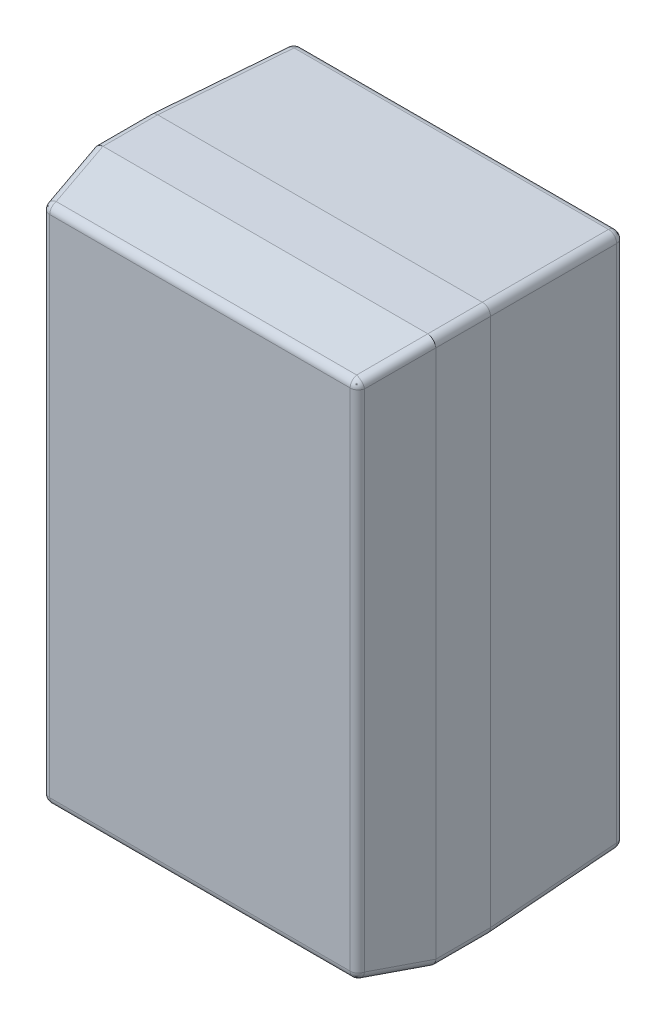
ISO-10303-21;
HEADER;
FILE_DESCRIPTION(('STEP AP214'),'2;1');
FILE_NAME('part.step','',(''),(''),'','','');
FILE_SCHEMA(('AUTOMOTIVE_DESIGN { 1 0 10303 214 1 1 1 1 }'));
ENDSEC;
DATA;
#1=APPLICATION_CONTEXT('core data for automotive mechanical design processes');
#2=APPLICATION_PROTOCOL_DEFINITION('international standard','automotive_design',2000,#1);
#3=PRODUCT_CONTEXT('',#1,'mechanical');
#4=PRODUCT('Part','Part','',(#3));
#5=PRODUCT_RELATED_PRODUCT_CATEGORY('part','',(#4));
#6=PRODUCT_DEFINITION_FORMATION('','',#4);
#7=PRODUCT_DEFINITION_CONTEXT('part definition',#1,'design');
#8=PRODUCT_DEFINITION('design','',#6,#7);
#9=PRODUCT_DEFINITION_SHAPE('','',#8);
#10=(LENGTH_UNIT() NAMED_UNIT(*) SI_UNIT(.MILLI.,.METRE.));
#11=(NAMED_UNIT(*) PLANE_ANGLE_UNIT() SI_UNIT($,.RADIAN.));
#12=(NAMED_UNIT(*) SI_UNIT($,.STERADIAN.) SOLID_ANGLE_UNIT());
#13=UNCERTAINTY_MEASURE_WITH_UNIT(LENGTH_MEASURE(1.E-05),#10,'distance_accuracy_value','');
#14=(GEOMETRIC_REPRESENTATION_CONTEXT(3) GLOBAL_UNCERTAINTY_ASSIGNED_CONTEXT((#13)) GLOBAL_UNIT_ASSIGNED_CONTEXT((#10,
#11,#12)) REPRESENTATION_CONTEXT('',''));
#15=CARTESIAN_POINT('',(0.,0.,0.));
#16=DIRECTION('',(0.,0.,1.));
#17=DIRECTION('',(1.,0.,0.));
#18=AXIS2_PLACEMENT_3D('',#15,#16,#17);
#19=CARTESIAN_POINT('',(36.300605794239,23.099392103058,0.97));
#20=DIRECTION('',(0.495788872155556,-0.495788785470221,0.713012534566318));
#21=DIRECTION('',(7.17758443513627E-08,-0.821023882220185,-0.570893847246658));
#22=AXIS2_PLACEMENT_3D('',#19,#20,#21);
#23=SPHERICAL_SURFACE('',#22,0.03);
#24=CARTESIAN_POINT('',(36.3154794604037,23.0845184394939,0.991390376036991));
#25=VERTEX_POINT('',#24);
#26=VERTEX_LOOP('',#25);
#27=FACE_BOUND('',#26,.T.);
#28=CARTESIAN_POINT('',(36.3006057942384,23.0993921030575,0.969999999999731));
#29=DIRECTION('',(-0.199840209214973,0.199840174273973,0.95923292037287));
#30=DIRECTION('',(0.978980416177481,0.,0.203954271200597));
#31=AXIS2_PLACEMENT_3D('',#28,#29,#30);
#32=CIRCLE('',#31,0.03);
#33=CARTESIAN_POINT('',(36.3299752000985,23.099392028073,0.976118659936651));
#34=VERTEX_POINT('',#33);
#35=CARTESIAN_POINT('',(36.300605796806,23.0700226904658,0.976118627623032));
#36=VERTEX_POINT('',#35);
#37=EDGE_CURVE('E132',#34,#36,#32,.F.);
#38=ORIENTED_EDGE('',*,*,#37,.F.);
#39=CARTESIAN_POINT('',(36.3006057942383,23.099392103058,0.97));
#40=DIRECTION('',(8.74227758795897E-08,-0.999999999999996,0.));
#41=DIRECTION('',(0.999999999999996,8.74227758795897E-08,0.));
#42=AXIS2_PLACEMENT_3D('',#39,#40,#41);
#43=CIRCLE('',#42,0.03);
#44=CARTESIAN_POINT('',(36.3006057942387,23.099392103058,1.));
#45=VERTEX_POINT('',#44);
#46=EDGE_CURVE('E134',#45,#34,#43,.F.);
#47=ORIENTED_EDGE('',*,*,#46,.F.);
#48=CARTESIAN_POINT('',(36.3006057942384,23.0993921030583,0.97));
#49=DIRECTION('',(-0.999999999999996,-8.74227759628497E-08,0.));
#50=DIRECTION('',(8.74227759628497E-08,-0.999999999999996,0.));
#51=AXIS2_PLACEMENT_3D('',#48,#49,#50);
#52=CIRCLE('',#51,0.03);
#53=EDGE_CURVE('E136',#36,#45,#52,.T.);
#54=ORIENTED_EDGE('',*,*,#53,.F.);
#55=EDGE_LOOP('',(#38,#47,#54));
#56=FACE_BOUND('',#55,.T.);
#57=ADVANCED_FACE('F17',(#27,#56),#23,.T.);
#58=CARTESIAN_POINT('',(36.300605632401,24.950603849697,0.97));
#59=DIRECTION('',(0.495788785469166,0.495788872156348,0.713012534566501));
#60=DIRECTION('',(7.17760416657498E-08,-0.82102388222028,0.570893847246521));
#61=AXIS2_PLACEMENT_3D('',#58,#59,#60);
#62=SPHERICAL_SURFACE('',#61,0.03);
#63=CARTESIAN_POINT('',(36.3154792959651,24.9654775158617,0.991390376036994));
#64=VERTEX_POINT('',#63);
#65=VERTEX_LOOP('',#64);
#66=FACE_BOUND('',#65,.T.);
#67=CARTESIAN_POINT('',(36.3006056324003,24.9506038496975,0.97));
#68=DIRECTION('',(8.74227758795897E-08,-0.999999999999996,0.));
#69=DIRECTION('',(0.999999999999996,8.74227758795897E-08,0.));
#70=AXIS2_PLACEMENT_3D('',#67,#68,#69);
#71=CIRCLE('',#70,0.03);
#72=CARTESIAN_POINT('',(36.3299750449924,24.950603852265,0.97611862762296));
#73=VERTEX_POINT('',#72);
#74=CARTESIAN_POINT('',(36.3006056324006,24.9506038496972,1.));
#75=VERTEX_POINT('',#74);
#76=EDGE_CURVE('E190',#73,#75,#71,.T.);
#77=ORIENTED_EDGE('',*,*,#76,.F.);
#78=CARTESIAN_POINT('',(36.3006056324002,24.9506038496974,0.969999999999683));
#79=DIRECTION('',(0.199840174273973,0.199840209214973,-0.95923292037287));
#80=DIRECTION('',(0.,0.978980416177481,0.203954271200597));
#81=AXIS2_PLACEMENT_3D('',#78,#79,#80);
#82=CIRCLE('',#81,0.03);
#83=CARTESIAN_POINT('',(36.3006056759662,24.9799732582851,0.976118646845316));
#84=VERTEX_POINT('',#83);
#85=EDGE_CURVE('E184',#84,#73,#82,.T.);
#86=ORIENTED_EDGE('',*,*,#85,.F.);
#87=CARTESIAN_POINT('',(36.300605632401,24.9506038496977,0.97));
#88=DIRECTION('',(0.999999999999996,8.74227757408097E-08,0.));
#89=DIRECTION('',(-8.74227757408097E-08,0.999999999999996,0.));
#90=AXIS2_PLACEMENT_3D('',#87,#88,#89);
#91=CIRCLE('',#90,0.03);
#92=EDGE_CURVE('E141',#75,#84,#91,.F.);
#93=ORIENTED_EDGE('',*,*,#92,.F.);
#94=EDGE_LOOP('',(#77,#86,#93));
#95=FACE_BOUND('',#94,.T.);
#96=ADVANCED_FACE('F128',(#66,#95),#62,.T.);
#97=CARTESIAN_POINT('',(35.199394047599,23.099392006787,0.97));
#98=DIRECTION('',(-0.495788785469166,-0.495788872156348,0.713012534566501));
#99=DIRECTION('',(7.17760416657498E-08,-0.82102388222028,-0.570893847246521));
#100=AXIS2_PLACEMENT_3D('',#97,#98,#99);
#101=SPHERICAL_SURFACE('',#100,0.03);
#102=CARTESIAN_POINT('',(35.1845203840349,23.0845183406223,0.991390376036994));
#103=VERTEX_POINT('',#102);
#104=VERTEX_LOOP('',#103);
#105=FACE_BOUND('',#104,.T.);
#106=CARTESIAN_POINT('',(35.1993940475998,23.0993920067866,0.969999999999684));
#107=DIRECTION('',(0.199840174273973,0.199840209214973,0.95923292037287));
#108=DIRECTION('',(0.,-0.978980416177481,0.203954271200597));
#109=AXIS2_PLACEMENT_3D('',#106,#107,#108);
#110=CIRCLE('',#109,0.03);
#111=CARTESIAN_POINT('',(35.1993940040338,23.0700225981998,0.976118646845116));
#112=VERTEX_POINT('',#111);
#113=CARTESIAN_POINT('',(35.1700246350076,23.099392004219,0.976118627622961));
#114=VERTEX_POINT('',#113);
#115=EDGE_CURVE('E182',#112,#114,#110,.F.);
#116=ORIENTED_EDGE('',*,*,#115,.F.);
#117=CARTESIAN_POINT('',(35.199394047599,23.0993920067873,0.97));
#118=DIRECTION('',(-0.999999999999996,-8.74227759628497E-08,0.));
#119=DIRECTION('',(8.74227759628497E-08,-0.999999999999996,0.));
#120=AXIS2_PLACEMENT_3D('',#117,#118,#119);
#121=CIRCLE('',#120,0.03);
#122=CARTESIAN_POINT('',(35.1993940475994,23.0993920067869,1.));
#123=VERTEX_POINT('',#122);
#124=EDGE_CURVE('E21',#123,#112,#121,.F.);
#125=ORIENTED_EDGE('',*,*,#124,.F.);
#126=CARTESIAN_POINT('',(35.1993940475997,23.0993920067866,0.97));
#127=DIRECTION('',(-8.74227757408097E-08,0.999999999999996,0.));
#128=DIRECTION('',(-0.999999999999996,-8.74227757408097E-08,0.));
#129=AXIS2_PLACEMENT_3D('',#126,#127,#128);
#130=CIRCLE('',#129,0.03);
#131=EDGE_CURVE('E177',#114,#123,#130,.T.);
#132=ORIENTED_EDGE('',*,*,#131,.F.);
#133=EDGE_LOOP('',(#116,#125,#132));
#134=FACE_BOUND('',#133,.T.);
#135=ADVANCED_FACE('F205',(#105,#134),#101,.T.);
#136=CARTESIAN_POINT('',(35.74999984,24.024997928242,1.));
#137=DIRECTION('',(0.,0.,1.));
#138=DIRECTION('',(0.,-1.,0.));
#139=AXIS2_PLACEMENT_3D('',#136,#137,#138);
#140=PLANE('',#139);
#141=DIRECTION('',(0.999999999999996,8.74227757408097E-08,0.));
#142=VECTOR('',#141,1.);
#143=CARTESIAN_POINT('',(35.906249759081,24.9506038152213,1.));
#144=LINE('',#143,#142);
#145=CARTESIAN_POINT('',(35.1993938857613,24.9506037534263,1.));
#146=VERTEX_POINT('',#145);
#147=EDGE_CURVE('E186',#146,#75,#144,.T.);
#148=ORIENTED_EDGE('',*,*,#147,.F.);
#149=DIRECTION('',(-8.74227757408097E-08,0.999999999999996,0.));
#150=VECTOR('',#149,1.);
#151=CARTESIAN_POINT('',(35.1993939448243,24.274997880107,1.));
#152=LINE('',#151,#150);
#153=EDGE_CURVE('E176',#123,#146,#152,.T.);
#154=ORIENTED_EDGE('',*,*,#153,.F.);
#155=DIRECTION('',(-0.999999999999996,-8.74227759628497E-08,0.));
#156=VECTOR('',#155,1.);
#157=CARTESIAN_POINT('',(35.593749920919,23.0993920412627,1.));
#158=LINE('',#157,#156);
#159=EDGE_CURVE('E110',#45,#123,#158,.T.);
#160=ORIENTED_EDGE('',*,*,#159,.F.);
#161=DIRECTION('',(8.74227758795897E-08,-0.999999999999996,0.));
#162=VECTOR('',#161,1.);
#163=CARTESIAN_POINT('',(36.3006057351757,23.774997976378,1.));
#164=LINE('',#163,#162);
#165=EDGE_CURVE('E142',#75,#45,#164,.T.);
#166=ORIENTED_EDGE('',*,*,#165,.F.);
#167=EDGE_LOOP('',(#148,#154,#160,#166));
#168=FACE_BOUND('',#167,.T.);
#169=ADVANCED_FACE('F306',(#168),#140,.T.);
#170=CARTESIAN_POINT('',(35.199393885761,24.950603753426,0.97));
#171=DIRECTION('',(-0.495788872155556,0.495788785470221,0.713012534566318));
#172=DIRECTION('',(7.17758443513627E-08,-0.821023882220185,0.570893847246658));
#173=AXIS2_PLACEMENT_3D('',#170,#171,#172);
#174=SPHERICAL_SURFACE('',#173,0.03);
#175=CARTESIAN_POINT('',(35.1845202195963,24.9654774169901,0.991390376036991));
#176=VERTEX_POINT('',#175);
#177=VERTEX_LOOP('',#176);
#178=FACE_BOUND('',#177,.T.);
#179=CARTESIAN_POINT('',(35.1993938857616,24.9506037534265,0.969999999999539));
#180=DIRECTION('',(0.199840209214973,-0.199840174273973,0.95923292037287));
#181=DIRECTION('',(0.978980416177481,0.,-0.203954271200597));
#182=AXIS2_PLACEMENT_3D('',#179,#180,#181);
#183=CIRCLE('',#182,0.03);
#184=CARTESIAN_POINT('',(35.1700244799015,24.950603828412,0.976118659936652));
#185=VERTEX_POINT('',#184);
#186=CARTESIAN_POINT('',(35.199393883194,24.9799731660188,0.976118627623049));
#187=VERTEX_POINT('',#186);
#188=EDGE_CURVE('E173',#185,#187,#183,.F.);
#189=ORIENTED_EDGE('',*,*,#188,.F.);
#190=CARTESIAN_POINT('',(35.1993938857617,24.950603753426,0.97));
#191=DIRECTION('',(-8.74227757408097E-08,0.999999999999996,0.));
#192=DIRECTION('',(-0.999999999999996,-8.74227757408097E-08,0.));
#193=AXIS2_PLACEMENT_3D('',#190,#191,#192);
#194=CIRCLE('',#193,0.03);
#195=EDGE_CURVE('E180',#146,#185,#194,.F.);
#196=ORIENTED_EDGE('',*,*,#195,.F.);
#197=CARTESIAN_POINT('',(35.1993938857616,24.9506037534267,0.97));
#198=DIRECTION('',(0.999999999999996,8.74227757408097E-08,0.));
#199=DIRECTION('',(-8.74227757408097E-08,0.999999999999996,0.));
#200=AXIS2_PLACEMENT_3D('',#197,#198,#199);
#201=CIRCLE('',#200,0.03);
#202=EDGE_CURVE('E187',#187,#146,#201,.T.);
#203=ORIENTED_EDGE('',*,*,#202,.F.);
#204=EDGE_LOOP('',(#189,#196,#203));
#205=FACE_BOUND('',#204,.T.);
#206=ADVANCED_FACE('F302',(#178,#205),#174,.T.);
#207=CARTESIAN_POINT('',(35.593749920919,23.099392041263,0.97));
#208=DIRECTION('',(-0.999999999999996,-8.74227759628497E-08,0.));
#209=DIRECTION('',(8.74227759628497E-08,-0.999999999999996,0.));
#210=AXIS2_PLACEMENT_3D('',#207,#208,#209);
#211=CYLINDRICAL_SURFACE('',#210,0.03);
#212=ORIENTED_EDGE('',*,*,#53,.T.);
#213=ORIENTED_EDGE('',*,*,#159,.T.);
#214=ORIENTED_EDGE('',*,*,#124,.T.);
#215=DIRECTION('',(0.999999999999996,8.37862212252657E-08,-1.74554627552565E-08));
#216=VECTOR('',#215,1.);
#217=CARTESIAN_POINT('',(35.437499925237,23.0700226181498,0.976118642688867));
#218=LINE('',#217,#216);
#219=EDGE_CURVE('E170',#36,#112,#218,.F.);
#220=ORIENTED_EDGE('',*,*,#219,.F.);
#221=EDGE_LOOP('',(#212,#213,#214,#220));
#222=FACE_BOUND('',#221,.T.);
#223=ADVANCED_FACE('F195',(#222),#211,.T.);
#224=CARTESIAN_POINT('',(36.300605735175,23.774997976378,0.97));
#225=DIRECTION('',(8.74227758795897E-08,-0.999999999999996,0.));
#226=DIRECTION('',(0.999999999999996,8.74227758795897E-08,0.));
#227=AXIS2_PLACEMENT_3D('',#224,#225,#226);
#228=CYLINDRICAL_SURFACE('',#227,0.03);
#229=ORIENTED_EDGE('',*,*,#76,.T.);
#230=ORIENTED_EDGE('',*,*,#165,.T.);
#231=ORIENTED_EDGE('',*,*,#46,.T.);
#232=DIRECTION('',(-8.3786221154828E-08,0.999999999999996,-1.7455462740582E-08));
#233=VECTOR('',#232,1.);
#234=CARTESIAN_POINT('',(36.3299751644386,23.524997980696,0.976118652507502));
#235=LINE('',#234,#233);
#236=EDGE_CURVE('E156',#73,#34,#235,.F.);
#237=ORIENTED_EDGE('',*,*,#236,.F.);
#238=EDGE_LOOP('',(#229,#230,#231,#237));
#239=FACE_BOUND('',#238,.T.);
#240=ADVANCED_FACE('F622',(#239),#228,.T.);
#241=CARTESIAN_POINT('',(36.294097736695,23.105900159463,1.001238673477));
#242=DIRECTION('',(-0.199840209214973,0.199840174273973,0.95923292037287));
#243=DIRECTION('',(0.978980416177481,0.,0.203954271200597));
#244=AXIS2_PLACEMENT_3D('',#241,#242,#243);
#245=CYLINDRICAL_SURFACE('',#244,0.03);
#246=DIRECTION('',(-0.199840209217155,0.199840174273618,0.959232920372489));
#247=VECTOR('',#246,1.);
#248=CARTESIAN_POINT('',(36.345624022549,23.025004472595,0.760031162950002));
#249=LINE('',#248,#247);
#250=CARTESIAN_POINT('',(36.345311974986,23.0250012264267,0.760015581475032));
#251=VERTEX_POINT('',#250);
#252=EDGE_CURVE('E175',#251,#36,#249,.T.);
#253=ORIENTED_EDGE('',*,*,#252,.F.);
#254=CARTESIAN_POINT('',(36.3449999247997,23.0549979802587,0.756908191935545));
#255=DIRECTION('',(-0.100954304954071,0.100954287302747,0.989755757844548));
#256=DIRECTION('',(0.699863069273979,-0.699862946906636,0.142770934764626));
#257=AXIS2_PLACEMENT_3D('',#254,#255,#256);
#258=ELLIPSE('',#257,0.0303105081857092,0.03);
#259=CARTESIAN_POINT('',(36.37499667866,23.0546859346755,0.760015581603179));
#260=VERTEX_POINT('',#259);
#261=EDGE_CURVE('E150',#260,#251,#258,.F.);
#262=ORIENTED_EDGE('',*,*,#261,.F.);
#263=DIRECTION('',(-0.1998402092147,0.199840174277006,0.959232920372294));
#264=VECTOR('',#263,1.);
#265=CARTESIAN_POINT('',(36.374993432573,23.054373887754,0.760031162950002));
#266=LINE('',#265,#264);
#267=EDGE_CURVE('E146',#34,#260,#266,.F.);
#268=ORIENTED_EDGE('',*,*,#267,.F.);
#269=ORIENTED_EDGE('',*,*,#37,.T.);
#270=EDGE_LOOP('',(#253,#262,#268,#269));
#271=FACE_BOUND('',#270,.T.);
#272=ADVANCED_FACE('F147',(#271),#245,.T.);
#273=CARTESIAN_POINT('',(35.906249759081,24.950603815222,0.97));
#274=DIRECTION('',(0.999999999999996,8.74227757408097E-08,0.));
#275=DIRECTION('',(-8.74227757408097E-08,0.999999999999996,0.));
#276=AXIS2_PLACEMENT_3D('',#273,#274,#275);
#277=CYLINDRICAL_SURFACE('',#276,0.03);
#278=ORIENTED_EDGE('',*,*,#202,.T.);
#279=ORIENTED_EDGE('',*,*,#147,.T.);
#280=ORIENTED_EDGE('',*,*,#92,.T.);
#281=DIRECTION('',(0.999999999999996,8.37862210064734E-08,1.74554627096748E-08));
#282=VECTOR('',#281,1.);
#283=CARTESIAN_POINT('',(36.062499754763,24.9799732383351,0.976118642689067));
#284=LINE('',#283,#282);
#285=EDGE_CURVE('E275',#187,#84,#284,.T.);
#286=ORIENTED_EDGE('',*,*,#285,.F.);
#287=EDGE_LOOP('',(#278,#279,#280,#286));
#288=FACE_BOUND('',#287,.T.);
#289=ADVANCED_FACE('F617',(#288),#277,.T.);
#290=CARTESIAN_POINT('',(36.28660955748,24.93660777233,1.03718116549));
#291=DIRECTION('',(0.199840174273973,0.199840209214973,-0.95923292037287));
#292=DIRECTION('',(0.,0.978980416177481,0.203954271200597));
#293=AXIS2_PLACEMENT_3D('',#290,#291,#292);
#294=CYLINDRICAL_SURFACE('',#293,0.03);
#295=DIRECTION('',(-0.199840174273781,-0.199840209212882,0.959232920373345));
#296=VECTOR('',#295,1.);
#297=CARTESIAN_POINT('',(36.3749932628637,24.995622078007,0.76003116294994));
#298=LINE('',#297,#296);
#299=CARTESIAN_POINT('',(36.374996509032,24.995310030444,0.76001558147498));
#300=VERTEX_POINT('',#299);
#301=EDGE_CURVE('E160',#300,#73,#298,.T.);
#302=ORIENTED_EDGE('',*,*,#301,.F.);
#303=CARTESIAN_POINT('',(36.3449997552,24.9949979802591,0.756908191932563));
#304=DIRECTION('',(-0.100954287302747,-0.100954304954071,0.989755757844548));
#305=DIRECTION('',(0.699862946906636,0.699863069273979,0.142770934764626));
#306=AXIS2_PLACEMENT_3D('',#303,#304,#305);
#307=ELLIPSE('',#306,0.0303105081857092,0.03);
#308=CARTESIAN_POINT('',(36.3453118007824,25.0249947341185,0.760015581603173));
#309=VERTEX_POINT('',#308);
#310=EDGE_CURVE('E221',#309,#300,#307,.F.);
#311=ORIENTED_EDGE('',*,*,#310,.F.);
#312=DIRECTION('',(-0.199840174272554,-0.199840209214916,0.959232920373177));
#313=VECTOR('',#312,1.);
#314=CARTESIAN_POINT('',(36.345623847704,25.0249914880322,0.760031162950046));
#315=LINE('',#314,#313);
#316=EDGE_CURVE('E295',#84,#309,#315,.F.);
#317=ORIENTED_EDGE('',*,*,#316,.F.);
#318=ORIENTED_EDGE('',*,*,#85,.T.);
#319=EDGE_LOOP('',(#302,#311,#317,#318));
#320=FACE_BOUND('',#319,.T.);
#321=ADVANCED_FACE('F415',(#320),#294,.T.);
#322=CARTESIAN_POINT('',(35.21339012252,23.113388084154,1.03718116549));
#323=DIRECTION('',(0.199840174273973,0.199840209214973,0.95923292037287));
#324=DIRECTION('',(0.,-0.978980416177481,0.203954271200597));
#325=AXIS2_PLACEMENT_3D('',#322,#323,#324);
#326=CYLINDRICAL_SURFACE('',#325,0.03);
#327=DIRECTION('',(0.19984017427378,0.199840209212881,0.959232920373346));
#328=VECTOR('',#327,1.);
#329=CARTESIAN_POINT('',(35.1250064171363,23.054373778477,0.76003116294994));
#330=LINE('',#329,#328);
#331=CARTESIAN_POINT('',(35.125003170968,23.05468582604,0.76001558147498));
#332=VERTEX_POINT('',#331);
#333=EDGE_CURVE('E215',#332,#114,#330,.T.);
#334=ORIENTED_EDGE('',*,*,#333,.F.);
#335=CARTESIAN_POINT('',(35.1549999248003,23.0549978762257,0.756908191934962));
#336=DIRECTION('',(0.100954287302747,0.100954304954071,0.989755757844548));
#337=DIRECTION('',(-0.699862946906636,-0.699863069273979,0.142770934764626));
#338=AXIS2_PLACEMENT_3D('',#335,#336,#337);
#339=ELLIPSE('',#338,0.0303105081857092,0.03);
#340=CARTESIAN_POINT('',(35.1546878792176,23.0250011223657,0.760015581603147));
#341=VERTEX_POINT('',#340);
#342=EDGE_CURVE('E212',#341,#332,#339,.F.);
#343=ORIENTED_EDGE('',*,*,#342,.F.);
#344=DIRECTION('',(0.199840174272613,0.199840209214914,0.959232920373165));
#345=VECTOR('',#344,1.);
#346=CARTESIAN_POINT('',(35.154375832296,23.0250043684527,0.760031162949847));
#347=LINE('',#346,#345);
#348=EDGE_CURVE('E167',#112,#341,#347,.F.);
#349=ORIENTED_EDGE('',*,*,#348,.F.);
#350=ORIENTED_EDGE('',*,*,#115,.T.);
#351=EDGE_LOOP('',(#334,#343,#349,#350));
#352=FACE_BOUND('',#351,.T.);
#353=ADVANCED_FACE('F210',(#352),#326,.T.);
#354=CARTESIAN_POINT('',(35.199393944825,24.274997880107,0.97));
#355=DIRECTION('',(-8.74227757408097E-08,0.999999999999996,0.));
#356=DIRECTION('',(-0.999999999999996,-8.74227757408097E-08,0.));
#357=AXIS2_PLACEMENT_3D('',#354,#355,#356);
#358=CYLINDRICAL_SURFACE('',#357,0.03);
#359=ORIENTED_EDGE('',*,*,#131,.T.);
#360=ORIENTED_EDGE('',*,*,#153,.T.);
#361=ORIENTED_EDGE('',*,*,#195,.T.);
#362=DIRECTION('',(-8.37862209971045E-08,0.999999999999996,1.7455462707723E-08));
#363=VECTOR('',#362,1.);
#364=CARTESIAN_POINT('',(35.1700245155614,24.524997875789,0.976118652507504));
#365=LINE('',#364,#363);
#366=EDGE_CURVE('E253',#114,#185,#365,.T.);
#367=ORIENTED_EDGE('',*,*,#366,.F.);
#368=EDGE_LOOP('',(#359,#360,#361,#367));
#369=FACE_BOUND('',#368,.T.);
#370=ADVANCED_FACE('F608',(#369),#358,.T.);
#371=CARTESIAN_POINT('',(35.205901943305,24.944095697021,1.001238673477));
#372=DIRECTION('',(0.199840209214973,-0.199840174273973,0.95923292037287));
#373=DIRECTION('',(0.978980416177481,0.,-0.203954271200597));
#374=AXIS2_PLACEMENT_3D('',#371,#372,#373);
#375=CYLINDRICAL_SURFACE('',#374,0.03);
#376=DIRECTION('',(0.199840209216978,-0.199840174273611,0.959232920372527));
#377=VECTOR('',#376,1.);
#378=CARTESIAN_POINT('',(35.154375657451,25.02499138389,0.760031162950002));
#379=LINE('',#378,#377);
#380=CARTESIAN_POINT('',(35.154687705014,25.0249946300576,0.760015581474998));
#381=VERTEX_POINT('',#380);
#382=EDGE_CURVE('E158',#381,#187,#379,.T.);
#383=ORIENTED_EDGE('',*,*,#382,.F.);
#384=CARTESIAN_POINT('',(35.1549997552,24.994997876226,0.756908191933162));
#385=DIRECTION('',(0.100954304954071,-0.100954287302747,0.989755757844548));
#386=DIRECTION('',(-0.699863069273979,0.699862946906636,0.142770934764626));
#387=AXIS2_PLACEMENT_3D('',#384,#385,#386);
#388=ELLIPSE('',#387,0.0303105081857092,0.03);
#389=CARTESIAN_POINT('',(35.1250030013133,24.9953099211665,0.760015581475001));
#390=VERTEX_POINT('',#389);
#391=EDGE_CURVE('E240',#390,#381,#388,.F.);
#392=ORIENTED_EDGE('',*,*,#391,.F.);
#393=DIRECTION('',(-0.1998402092149,0.199840174272766,-0.959232920373136));
#394=VECTOR('',#393,1.);
#395=CARTESIAN_POINT('',(35.1700244731695,24.950603750859,0.976118627622905));
#396=LINE('',#395,#394);
#397=EDGE_CURVE('E244',#185,#390,#396,.T.);
#398=ORIENTED_EDGE('',*,*,#397,.F.);
#399=ORIENTED_EDGE('',*,*,#188,.T.);
#400=EDGE_LOOP('',(#383,#392,#398,#399));
#401=FACE_BOUND('',#400,.T.);
#402=ADVANCED_FACE('F605',(#401),#375,.T.);
#403=CARTESIAN_POINT('',(35.437499925237,23.049997900923,0.88));
#404=DIRECTION('',(8.55851859097666E-08,-0.978980419737618,0.20395425411192));
#405=DIRECTION('',(0.,-0.203954254111921,-0.978980419737622));
#406=AXIS2_PLACEMENT_3D('',#403,#404,#405);
#407=PLANE('',#406);
#408=ORIENTED_EDGE('',*,*,#219,.T.);
#409=ORIENTED_EDGE('',*,*,#348,.T.);
#410=DIRECTION('',(0.999999999999996,8.74227759628497E-08,0.));
#411=VECTOR('',#410,1.);
#412=CARTESIAN_POINT('',(35.124999927423,23.024997873603,0.76));
#413=LINE('',#412,#411);
#414=EDGE_CURVE('E226',#251,#341,#413,.F.);
#415=ORIENTED_EDGE('',*,*,#414,.F.);
#416=ORIENTED_EDGE('',*,*,#252,.T.);
#417=EDGE_LOOP('',(#408,#409,#415,#416));
#418=FACE_BOUND('',#417,.T.);
#419=ADVANCED_FACE('F200',(#418),#407,.T.);
#420=CARTESIAN_POINT('',(36.349999883711,23.524997980696,0.88));
#421=DIRECTION('',(0.978980419737618,8.55851858378166E-08,0.20395425411192));
#422=DIRECTION('',(0.203954254111921,0.,-0.978980419737622));
#423=AXIS2_PLACEMENT_3D('',#420,#421,#422);
#424=PLANE('',#423);
#425=ORIENTED_EDGE('',*,*,#267,.T.);
#426=DIRECTION('',(-8.74227758795897E-08,0.999999999999996,0.));
#427=VECTOR('',#426,1.);
#428=CARTESIAN_POINT('',(36.374999927423,23.024997982881,0.76));
#429=LINE('',#428,#427);
#430=EDGE_CURVE('E278',#300,#260,#429,.F.);
#431=ORIENTED_EDGE('',*,*,#430,.F.);
#432=ORIENTED_EDGE('',*,*,#301,.T.);
#433=ORIENTED_EDGE('',*,*,#236,.T.);
#434=EDGE_LOOP('',(#425,#431,#432,#433));
#435=FACE_BOUND('',#434,.T.);
#436=ADVANCED_FACE('F600',(#435),#424,.T.);
#437=CARTESIAN_POINT('',(36.3449999248,23.054997980259,0.05));
#438=DIRECTION('',(0.,0.,1.));
#439=DIRECTION('',(0.,-1.,0.));
#440=AXIS2_PLACEMENT_3D('',#437,#438,#439);
#441=CYLINDRICAL_SURFACE('',#440,0.03);
#442=DIRECTION('',(0.,0.,1.));
#443=VECTOR('',#442,1.);
#444=CARTESIAN_POINT('',(36.344999927423,23.0249979802588,0.05));
#445=LINE('',#444,#443);
#446=CARTESIAN_POINT('',(36.3450114470718,23.0249979832081,0.559999962440938));
#447=VERTEX_POINT('',#446);
#448=EDGE_CURVE('E233',#447,#251,#445,.T.);
#449=ORIENTED_EDGE('',*,*,#448,.F.);
#450=CARTESIAN_POINT('',(36.3449999247999,23.0549979802588,0.560588009312289));
#451=DIRECTION('',(-0.019585273933744,0.0195852705093452,-0.999616343515859));
#452=DIRECTION('',(-0.706835556878502,0.706835433291423,0.0276977575984773));
#453=AXIS2_PLACEMENT_3D('',#450,#451,#452);
#454=ELLIPSE('',#453,0.030011514111988,0.03);
#455=CARTESIAN_POINT('',(36.3749999203799,23.0549864661799,0.559999924841336));
#456=VERTEX_POINT('',#455);
#457=EDGE_CURVE('E376',#456,#447,#454,.T.);
#458=ORIENTED_EDGE('',*,*,#457,.F.);
#459=DIRECTION('',(0.,0.,1.));
#460=VECTOR('',#459,1.);
#461=CARTESIAN_POINT('',(36.3749999248003,23.054997982881,0.05));
#462=LINE('',#461,#460);
#463=EDGE_CURVE('E280',#260,#456,#462,.F.);
#464=ORIENTED_EDGE('',*,*,#463,.F.);
#465=ORIENTED_EDGE('',*,*,#261,.T.);
#466=EDGE_LOOP('',(#449,#458,#464,#465));
#467=FACE_BOUND('',#466,.T.);
#468=ADVANCED_FACE('F456',(#467),#441,.T.);
#469=CARTESIAN_POINT('',(36.062499754763,24.999997955562,0.88));
#470=DIRECTION('',(-8.55851856862766E-08,0.978980419737618,0.20395425411192));
#471=DIRECTION('',(0.,-0.203954254111921,0.978980419737622));
#472=AXIS2_PLACEMENT_3D('',#469,#470,#471);
#473=PLANE('',#472);
#474=ORIENTED_EDGE('',*,*,#316,.T.);
#475=DIRECTION('',(-0.999999999999996,-8.74227757408097E-08,0.));
#476=VECTOR('',#475,1.);
#477=CARTESIAN_POINT('',(36.374999752577,25.024997982881,0.76));
#478=LINE('',#477,#476);
#479=EDGE_CURVE('E266',#381,#309,#478,.F.);
#480=ORIENTED_EDGE('',*,*,#479,.F.);
#481=ORIENTED_EDGE('',*,*,#382,.T.);
#482=ORIENTED_EDGE('',*,*,#285,.T.);
#483=EDGE_LOOP('',(#474,#480,#481,#482));
#484=FACE_BOUND('',#483,.T.);
#485=ADVANCED_FACE('F396',(#484),#473,.T.);
#486=CARTESIAN_POINT('',(36.3449997552,24.994997980259,0.05));
#487=DIRECTION('',(0.,0.,1.));
#488=DIRECTION('',(0.,-1.,0.));
#489=AXIS2_PLACEMENT_3D('',#486,#487,#488);
#490=CYLINDRICAL_SURFACE('',#489,0.03);
#491=DIRECTION('',(0.,0.,1.));
#492=VECTOR('',#491,1.);
#493=CARTESIAN_POINT('',(36.3749997552001,24.994997982881,0.05));
#494=LINE('',#493,#492);
#495=CARTESIAN_POINT('',(36.3749997522508,24.9950095025298,0.559999962440949));
#496=VERTEX_POINT('',#495);
#497=EDGE_CURVE('E234',#496,#300,#494,.T.);
#498=ORIENTED_EDGE('',*,*,#497,.F.);
#499=CARTESIAN_POINT('',(36.3449997552001,24.9949979802589,0.560588009306224));
#500=DIRECTION('',(-0.0195852705093452,-0.019585273933744,-0.999616343515859));
#501=DIRECTION('',(-0.706835433291423,-0.706835556878502,0.0276977575984774));
#502=AXIS2_PLACEMENT_3D('',#499,#500,#501);
#503=ELLIPSE('',#502,0.030011514111988,0.03);
#504=CARTESIAN_POINT('',(36.3450112700165,25.0249979758378,0.55999991541711));
#505=VERTEX_POINT('',#504);
#506=EDGE_CURVE('E369',#505,#496,#503,.T.);
#507=ORIENTED_EDGE('',*,*,#506,.F.);
#508=DIRECTION('',(0.,0.,1.));
#509=VECTOR('',#508,1.);
#510=CARTESIAN_POINT('',(36.344999752577,25.0249979802583,0.05));
#511=LINE('',#510,#509);
#512=EDGE_CURVE('E269',#309,#505,#511,.F.);
#513=ORIENTED_EDGE('',*,*,#512,.F.);
#514=ORIENTED_EDGE('',*,*,#310,.T.);
#515=EDGE_LOOP('',(#498,#507,#513,#514));
#516=FACE_BOUND('',#515,.T.);
#517=ADVANCED_FACE('F421',(#516),#490,.T.);
#518=CARTESIAN_POINT('',(35.1549999248,23.054997876226,0.05));
#519=DIRECTION('',(0.,0.,1.));
#520=DIRECTION('',(0.,-1.,0.));
#521=AXIS2_PLACEMENT_3D('',#518,#519,#520);
#522=CYLINDRICAL_SURFACE('',#521,0.03);
#523=DIRECTION('',(0.,0.,1.));
#524=VECTOR('',#523,1.);
#525=CARTESIAN_POINT('',(35.1249999247999,23.054997873603,0.05));
#526=LINE('',#525,#524);
#527=CARTESIAN_POINT('',(35.1249999277492,23.0549863539542,0.559999962440949));
#528=VERTEX_POINT('',#527);
#529=EDGE_CURVE('E263',#528,#332,#526,.T.);
#530=ORIENTED_EDGE('',*,*,#529,.F.);
#531=CARTESIAN_POINT('',(35.1549999247999,23.0549978762261,0.560588009306179));
#532=DIRECTION('',(0.0195852705093452,0.019585273933744,-0.999616343515859));
#533=DIRECTION('',(0.706835433291422,0.706835556878503,0.0276977575984773));
#534=AXIS2_PLACEMENT_3D('',#531,#532,#533);
#535=ELLIPSE('',#534,0.030011514111988,0.03);
#536=CARTESIAN_POINT('',(35.1549884107215,23.024997880646,0.559999924841351));
#537=VERTEX_POINT('',#536);
#538=EDGE_CURVE('E238',#537,#528,#535,.T.);
#539=ORIENTED_EDGE('',*,*,#538,.F.);
#540=DIRECTION('',(0.,0.,1.));
#541=VECTOR('',#540,1.);
#542=CARTESIAN_POINT('',(35.154999927423,23.0249978762257,0.05));
#543=LINE('',#542,#541);
#544=EDGE_CURVE('E230',#341,#537,#543,.F.);
#545=ORIENTED_EDGE('',*,*,#544,.F.);
#546=ORIENTED_EDGE('',*,*,#342,.T.);
#547=EDGE_LOOP('',(#530,#539,#545,#546));
#548=FACE_BOUND('',#547,.T.);
#549=ADVANCED_FACE('F236',(#548),#522,.T.);
#550=CARTESIAN_POINT('',(35.149999796289,24.524997875789,0.88));
#551=DIRECTION('',(-0.978980419737618,-8.55851856767066E-08,0.20395425411192));
#552=DIRECTION('',(0.203954254111921,0.,0.978980419737622));
#553=AXIS2_PLACEMENT_3D('',#550,#551,#552);
#554=PLANE('',#553);
#555=ORIENTED_EDGE('',*,*,#366,.T.);
#556=ORIENTED_EDGE('',*,*,#397,.T.);
#557=DIRECTION('',(8.74227757408097E-08,-0.999999999999996,0.));
#558=VECTOR('',#557,1.);
#559=CARTESIAN_POINT('',(35.124999752577,25.024997873603,0.76));
#560=LINE('',#559,#558);
#561=EDGE_CURVE('E259',#332,#390,#560,.F.);
#562=ORIENTED_EDGE('',*,*,#561,.F.);
#563=ORIENTED_EDGE('',*,*,#333,.T.);
#564=EDGE_LOOP('',(#555,#556,#562,#563));
#565=FACE_BOUND('',#564,.T.);
#566=ADVANCED_FACE('F588',(#565),#554,.T.);
#567=CARTESIAN_POINT('',(35.1549997552,24.994997876226,0.05));
#568=DIRECTION('',(0.,0.,1.));
#569=DIRECTION('',(0.,-1.,0.));
#570=AXIS2_PLACEMENT_3D('',#567,#568,#569);
#571=CYLINDRICAL_SURFACE('',#570,0.03);
#572=DIRECTION('',(0.,0.,1.));
#573=VECTOR('',#572,1.);
#574=CARTESIAN_POINT('',(35.154999752577,25.0249978762252,0.05));
#575=LINE('',#574,#573);
#576=CARTESIAN_POINT('',(35.1549882329282,25.0249978732765,0.559999962440938));
#577=VERTEX_POINT('',#576);
#578=EDGE_CURVE('E270',#577,#381,#575,.T.);
#579=ORIENTED_EDGE('',*,*,#578,.F.);
#580=CARTESIAN_POINT('',(35.1549997551999,24.9949978762259,0.560588009324894));
#581=DIRECTION('',(-0.019585273933744,0.0195852705093452,0.999616343515859));
#582=DIRECTION('',(-0.706835556878504,0.706835433291422,-0.0276977575984773));
#583=AXIS2_PLACEMENT_3D('',#580,#581,#582);
#584=ELLIPSE('',#583,0.030011514111988,0.03);
#585=CARTESIAN_POINT('',(35.1249997596201,24.9950093903041,0.559999924841336));
#586=VERTEX_POINT('',#585);
#587=EDGE_CURVE('E262',#586,#577,#584,.F.);
#588=ORIENTED_EDGE('',*,*,#587,.F.);
#589=DIRECTION('',(0.,0.,1.));
#590=VECTOR('',#589,1.);
#591=CARTESIAN_POINT('',(35.1249997551997,24.994997873603,0.05));
#592=LINE('',#591,#590);
#593=EDGE_CURVE('E368',#390,#586,#592,.F.);
#594=ORIENTED_EDGE('',*,*,#593,.F.);
#595=ORIENTED_EDGE('',*,*,#391,.T.);
#596=EDGE_LOOP('',(#579,#588,#594,#595));
#597=FACE_BOUND('',#596,.T.);
#598=ADVANCED_FACE('F505',(#597),#571,.T.);
#599=CARTESIAN_POINT('',(35.124999927423,23.024997873603,0.05));
#600=DIRECTION('',(8.74227759628497E-08,-0.999999999999996,0.));
#601=DIRECTION('',(0.999999999999996,8.74227759628497E-08,0.));
#602=AXIS2_PLACEMENT_3D('',#599,#600,#601);
#603=PLANE('',#602);
#604=ORIENTED_EDGE('',*,*,#448,.T.);
#605=ORIENTED_EDGE('',*,*,#414,.T.);
#606=ORIENTED_EDGE('',*,*,#544,.T.);
#607=DIRECTION('',(0.999999999999996,8.7288537534643E-08,3.42307990331736E-09));
#608=VECTOR('',#607,1.);
#609=CARTESIAN_POINT('',(35.437499926549,23.0249979010448,0.559999996893562));
#610=LINE('',#609,#608);
#611=EDGE_CURVE('E473',#447,#537,#610,.F.);
#612=ORIENTED_EDGE('',*,*,#611,.F.);
#613=EDGE_LOOP('',(#604,#605,#606,#612));
#614=FACE_BOUND('',#613,.T.);
#615=ADVANCED_FACE('F227',(#614),#603,.T.);
#616=CARTESIAN_POINT('',(36.374999927423,23.024997982881,0.05));
#617=DIRECTION('',(0.999999999999996,8.74227758795897E-08,0.));
#618=DIRECTION('',(-8.74227758795897E-08,0.999999999999996,0.));
#619=AXIS2_PLACEMENT_3D('',#616,#617,#618);
#620=PLANE('',#619);
#621=ORIENTED_EDGE('',*,*,#463,.T.);
#622=DIRECTION('',(-8.72885374496683E-08,0.999999999999996,3.42307989998502E-09));
#623=VECTOR('',#622,1.);
#624=CARTESIAN_POINT('',(36.3749998835137,23.524997982007,0.559999994968092));
#625=LINE('',#624,#623);
#626=EDGE_CURVE('E442',#496,#456,#625,.F.);
#627=ORIENTED_EDGE('',*,*,#626,.F.);
#628=ORIENTED_EDGE('',*,*,#497,.T.);
#629=ORIENTED_EDGE('',*,*,#430,.T.);
#630=EDGE_LOOP('',(#621,#627,#628,#629));
#631=FACE_BOUND('',#630,.T.);
#632=ADVANCED_FACE('F440',(#631),#620,.T.);
#633=CARTESIAN_POINT('',(36.333982301395,23.066015601737,0.279638637054));
#634=DIRECTION('',(-0.0391555198328113,0.0391555129866413,-0.998465668448032));
#635=DIRECTION('',(-0.999231950597407,0.,0.039185570115806));
#636=AXIS2_PLACEMENT_3D('',#633,#634,#635);
#637=CYLINDRICAL_SURFACE('',#636,0.03);
#638=DIRECTION('',(-0.0391555198328078,0.0391555129864286,-0.99846566844804));
#639=VECTOR('',#638,1.);
#640=CARTESIAN_POINT('',(36.37499991596,23.054974950245,0.559999774536));
#641=LINE('',#640,#639);
#642=CARTESIAN_POINT('',(36.3561302930737,23.0738445698322,0.0788244329991345));
#643=VERTEX_POINT('',#642);
#644=EDGE_CURVE('E361',#456,#643,#641,.T.);
#645=ORIENTED_EDGE('',*,*,#644,.F.);
#646=ORIENTED_EDGE('',*,*,#457,.T.);
#647=DIRECTION('',(0.0391555198326039,-0.0391555129866166,0.998465668448041));
#648=VECTOR('',#647,1.);
#649=CARTESIAN_POINT('',(36.326153337173,23.04386760869,0.0788244329991404));
#650=LINE('',#649,#648);
#651=CARTESIAN_POINT('',(36.3261533371728,23.0438676086899,0.0788244329991405));
#652=VERTEX_POINT('',#651);
#653=EDGE_CURVE('E479',#652,#447,#650,.T.);
#654=ORIENTED_EDGE('',*,*,#653,.F.);
#655=CARTESIAN_POINT('',(36.3261533345516,23.0738445672115,0.0800000000000137));
#656=DIRECTION('',(-0.0391555198328113,0.0391555129866413,-0.998465668448032));
#657=DIRECTION('',(-0.999231950597407,0.,0.039185570115806));
#658=AXIS2_PLACEMENT_3D('',#655,#656,#657);
#659=CIRCLE('',#658,0.03);
#660=EDGE_CURVE('E358',#643,#652,#659,.T.);
#661=ORIENTED_EDGE('',*,*,#660,.F.);
#662=EDGE_LOOP('',(#645,#646,#654,#661));
#663=FACE_BOUND('',#662,.T.);
#664=ADVANCED_FACE('F462',(#663),#637,.T.);
#665=CARTESIAN_POINT('',(36.374999752577,25.024997982881,0.05));
#666=DIRECTION('',(-8.74227757408097E-08,0.999999999999996,0.));
#667=DIRECTION('',(-0.999999999999996,-8.74227757408097E-08,0.));
#668=AXIS2_PLACEMENT_3D('',#665,#666,#667);
#669=PLANE('',#668);
#670=ORIENTED_EDGE('',*,*,#512,.T.);
#671=DIRECTION('',(0.999999999999996,8.72885373141125E-08,-3.42307989466911E-09));
#672=VECTOR('',#671,1.);
#673=CARTESIAN_POINT('',(36.062499753451,25.0249979554402,0.559999996893562));
#674=LINE('',#673,#672);
#675=EDGE_CURVE('E355',#577,#505,#674,.T.);
#676=ORIENTED_EDGE('',*,*,#675,.F.);
#677=ORIENTED_EDGE('',*,*,#578,.T.);
#678=ORIENTED_EDGE('',*,*,#479,.T.);
#679=EDGE_LOOP('',(#670,#676,#677,#678));
#680=FACE_BOUND('',#679,.T.);
#681=ADVANCED_FACE('F407',(#680),#669,.T.);
#682=CARTESIAN_POINT('',(36.333694667285,24.983692890367,0.272308242267));
#683=DIRECTION('',(-0.0391555129866413,-0.0391555198328113,-0.998465668448032));
#684=DIRECTION('',(0.,0.999231950597407,-0.039185570115806));
#685=AXIS2_PLACEMENT_3D('',#682,#683,#684);
#686=CYLINDRICAL_SURFACE('',#685,0.03);
#687=DIRECTION('',(0.0391555129884916,0.0391555198327902,0.99846566844796));
#688=VECTOR('',#687,1.);
#689=CARTESIAN_POINT('',(36.326153165626,25.0061283485329,0.0788244329991457));
#690=LINE('',#689,#688);
#691=CARTESIAN_POINT('',(36.3261531656259,25.006128348533,0.0788244329991216));
#692=VERTEX_POINT('',#691);
#693=EDGE_CURVE('E353',#505,#692,#690,.F.);
#694=ORIENTED_EDGE('',*,*,#693,.F.);
#695=ORIENTED_EDGE('',*,*,#506,.T.);
#696=DIRECTION('',(0.0391555129866095,0.0391555198326111,0.998465668448041));
#697=VECTOR('',#696,1.);
#698=CARTESIAN_POINT('',(36.3561301267687,24.976151392631,0.0788244329991527));
#699=LINE('',#698,#697);
#700=CARTESIAN_POINT('',(36.3561301267691,24.9761513926313,0.0788244329991364));
#701=VERTEX_POINT('',#700);
#702=EDGE_CURVE('E454',#701,#496,#699,.T.);
#703=ORIENTED_EDGE('',*,*,#702,.F.);
#704=CARTESIAN_POINT('',(36.3261531682476,24.976151390011,0.0799999999999566));
#705=DIRECTION('',(-0.0391555129866413,-0.0391555198328113,-0.998465668448032));
#706=DIRECTION('',(0.,0.999231950597407,-0.039185570115806));
#707=AXIS2_PLACEMENT_3D('',#704,#705,#706);
#708=CIRCLE('',#707,0.03);
#709=EDGE_CURVE('E351',#692,#701,#708,.T.);
#710=ORIENTED_EDGE('',*,*,#709,.F.);
#711=EDGE_LOOP('',(#694,#695,#703,#710));
#712=FACE_BOUND('',#711,.T.);
#713=ADVANCED_FACE('F573',(#712),#686,.T.);
#714=CARTESIAN_POINT('',(35.166305012715,23.066302966118,0.272308242267));
#715=DIRECTION('',(0.0391555129866413,0.0391555198328113,-0.998465668448032));
#716=DIRECTION('',(0.,0.999231950597407,0.039185570115806));
#717=AXIS2_PLACEMENT_3D('',#714,#715,#716);
#718=CYLINDRICAL_SURFACE('',#717,0.03);
#719=DIRECTION('',(0.0391555129884741,0.0391555198327871,-0.998465668447961));
#720=VECTOR('',#719,1.);
#721=CARTESIAN_POINT('',(35.154976894786,23.0249978850658,0.559999774536031));
#722=LINE('',#721,#720);
#723=CARTESIAN_POINT('',(35.1738465143736,23.043867507952,0.0788244329991518));
#724=VERTEX_POINT('',#723);
#725=EDGE_CURVE('E364',#537,#724,#722,.T.);
#726=ORIENTED_EDGE('',*,*,#725,.F.);
#727=ORIENTED_EDGE('',*,*,#538,.T.);
#728=DIRECTION('',(-0.0391555129866095,-0.0391555198325967,0.998465668448042));
#729=VECTOR('',#728,1.);
#730=CARTESIAN_POINT('',(35.1438695532313,23.073844463853,0.0788244329991527));
#731=LINE('',#730,#729);
#732=CARTESIAN_POINT('',(35.1438695531674,23.0738444638532,0.0788244346270872));
#733=VERTEX_POINT('',#732);
#734=EDGE_CURVE('E516',#733,#528,#731,.T.);
#735=ORIENTED_EDGE('',*,*,#734,.F.);
#736=CARTESIAN_POINT('',(35.1738465117524,23.073844466474,0.0799999999999956));
#737=DIRECTION('',(0.0391555129866413,0.0391555198328113,-0.998465668448032));
#738=DIRECTION('',(0.,0.999231950597407,0.039185570115806));
#739=AXIS2_PLACEMENT_3D('',#736,#737,#738);
#740=CIRCLE('',#739,0.03);
#741=EDGE_CURVE('E348',#724,#733,#740,.T.);
#742=ORIENTED_EDGE('',*,*,#741,.F.);
#743=EDGE_LOOP('',(#726,#727,#735,#742));
#744=FACE_BOUND('',#743,.T.);
#745=ADVANCED_FACE('F570',(#744),#718,.T.);
#746=CARTESIAN_POINT('',(35.124999752577,25.024997873603,0.05));
#747=DIRECTION('',(-0.999999999999996,-8.74227757408097E-08,0.));
#748=DIRECTION('',(8.74227757408097E-08,-0.999999999999996,0.));
#749=AXIS2_PLACEMENT_3D('',#746,#747,#748);
#750=PLANE('',#749);
#751=ORIENTED_EDGE('',*,*,#529,.T.);
#752=ORIENTED_EDGE('',*,*,#561,.T.);
#753=ORIENTED_EDGE('',*,*,#593,.T.);
#754=DIRECTION('',(-8.72885373159511E-08,0.999999999999996,-3.42307989474121E-09));
#755=VECTOR('',#754,1.);
#756=CARTESIAN_POINT('',(35.1249997964863,24.524997874477,0.559999994968092));
#757=LINE('',#756,#755);
#758=EDGE_CURVE('E347',#528,#586,#757,.T.);
#759=ORIENTED_EDGE('',*,*,#758,.F.);
#760=EDGE_LOOP('',(#751,#752,#753,#759));
#761=FACE_BOUND('',#760,.T.);
#762=ADVANCED_FACE('F499',(#761),#750,.T.);
#763=CARTESIAN_POINT('',(35.166017378605,24.983980254747,0.279638637054));
#764=DIRECTION('',(-0.0391555198328113,0.0391555129866413,0.998465668448032));
#765=DIRECTION('',(0.999231950597407,0.,0.039185570115806));
#766=AXIS2_PLACEMENT_3D('',#763,#764,#765);
#767=CYLINDRICAL_SURFACE('',#766,0.03);
#768=DIRECTION('',(0.0391555198328078,-0.0391555129864214,-0.998465668448041));
#769=VECTOR('',#768,1.);
#770=CARTESIAN_POINT('',(35.12499976404,24.995020906239,0.559999774536));
#771=LINE('',#770,#769);
#772=CARTESIAN_POINT('',(35.1438693869263,24.9761512866524,0.0788244329991648));
#773=VERTEX_POINT('',#772);
#774=EDGE_CURVE('E350',#586,#773,#771,.T.);
#775=ORIENTED_EDGE('',*,*,#774,.F.);
#776=ORIENTED_EDGE('',*,*,#587,.T.);
#777=DIRECTION('',(-0.0391555198325895,0.0391555129866167,0.998465668448042));
#778=VECTOR('',#777,1.);
#779=CARTESIAN_POINT('',(35.173846342827,25.006128247795,0.0788244329991405));
#780=LINE('',#779,#778);
#781=CARTESIAN_POINT('',(35.1738463428272,25.0061282477948,0.07882443299915));
#782=VERTEX_POINT('',#781);
#783=EDGE_CURVE('E360',#782,#577,#780,.T.);
#784=ORIENTED_EDGE('',*,*,#783,.F.);
#785=CARTESIAN_POINT('',(35.1738463454484,24.9761512892725,0.0800000000000533));
#786=DIRECTION('',(-0.0391555198328113,0.0391555129866413,0.998465668448032));
#787=DIRECTION('',(0.999231950597407,0.,0.039185570115806));
#788=AXIS2_PLACEMENT_3D('',#785,#786,#787);
#789=CIRCLE('',#788,0.03);
#790=EDGE_CURVE('E345',#773,#782,#789,.F.);
#791=ORIENTED_EDGE('',*,*,#790,.F.);
#792=EDGE_LOOP('',(#775,#776,#784,#791));
#793=FACE_BOUND('',#792,.T.);
#794=ADVANCED_FACE('F519',(#793),#767,.T.);
#795=CARTESIAN_POINT('',(35.437499926549,23.034997900923,0.305));
#796=DIRECTION('',(8.73556309630998E-08,-0.99923195073154,-0.0391855666953319));
#797=DIRECTION('',(0.,0.0391855666953321,-0.999231950731543));
#798=AXIS2_PLACEMENT_3D('',#795,#796,#797);
#799=PLANE('',#798);
#800=ORIENTED_EDGE('',*,*,#653,.T.);
#801=ORIENTED_EDGE('',*,*,#611,.T.);
#802=ORIENTED_EDGE('',*,*,#725,.T.);
#803=DIRECTION('',(0.999999999999996,8.74227759628497E-08,0.));
#804=VECTOR('',#803,1.);
#805=CARTESIAN_POINT('',(35.5937499257727,23.0438675446611,0.078824432999132));
#806=LINE('',#805,#804);
#807=EDGE_CURVE('E341',#652,#724,#806,.F.);
#808=ORIENTED_EDGE('',*,*,#807,.F.);
#809=EDGE_LOOP('',(#800,#801,#802,#808));
#810=FACE_BOUND('',#809,.T.);
#811=ADVANCED_FACE('F562',(#810),#799,.T.);
#812=CARTESIAN_POINT('',(36.364999883711,23.524997982007,0.305));
#813=DIRECTION('',(0.99923195073154,8.73556308780598E-08,-0.0391855666953319));
#814=DIRECTION('',(-0.0391855666953321,0.,-0.999231950731543));
#815=AXIS2_PLACEMENT_3D('',#812,#813,#814);
#816=PLANE('',#815);
#817=ORIENTED_EDGE('',*,*,#644,.T.);
#818=DIRECTION('',(-8.74227758795897E-08,0.999999999999996,0.));
#819=VECTOR('',#818,1.);
#820=CARTESIAN_POINT('',(36.3561302317769,23.7749979812317,0.0788244329991487));
#821=LINE('',#820,#819);
#822=EDGE_CURVE('E335',#701,#643,#821,.F.);
#823=ORIENTED_EDGE('',*,*,#822,.F.);
#824=ORIENTED_EDGE('',*,*,#702,.T.);
#825=ORIENTED_EDGE('',*,*,#626,.T.);
#826=EDGE_LOOP('',(#817,#823,#824,#825));
#827=FACE_BOUND('',#826,.T.);
#828=ADVANCED_FACE('F449',(#827),#816,.T.);
#829=CARTESIAN_POINT('',(36.326153334552,23.073844567212,0.08));
#830=DIRECTION('',(0.562128545715771,-0.562128447430165,-0.606649080343178));
#831=DIRECTION('',(-6.41252845823281E-08,0.733509638459424,-0.679679049469027));
#832=AXIS2_PLACEMENT_3D('',#829,#830,#831);
#833=SPHERICAL_SURFACE('',#832,0.03);
#834=CARTESIAN_POINT('',(36.3430171909235,23.0569807137891,0.0618005275897042));
#835=VERTEX_POINT('',#834);
#836=VERTEX_LOOP('',#835);
#837=FACE_BOUND('',#836,.T.);
#838=ORIENTED_EDGE('',*,*,#660,.T.);
#839=CARTESIAN_POINT('',(36.326153334552,23.0738445672117,0.08));
#840=DIRECTION('',(0.999999999999996,8.74227759628497E-08,0.));
#841=DIRECTION('',(-8.74227759628497E-08,0.999999999999996,0.));
#842=AXIS2_PLACEMENT_3D('',#839,#840,#841);
#843=CIRCLE('',#842,0.03);
#844=CARTESIAN_POINT('',(36.326153334552,23.0738445168429,0.0500000000000001));
#845=VERTEX_POINT('',#844);
#846=EDGE_CURVE('E342',#845,#652,#843,.F.);
#847=ORIENTED_EDGE('',*,*,#846,.F.);
#848=CARTESIAN_POINT('',(36.3261533345518,23.0738445672113,0.08));
#849=DIRECTION('',(-8.74227758795897E-08,0.999999999999996,0.));
#850=DIRECTION('',(-0.999999999999996,-8.74227758795897E-08,0.));
#851=AXIS2_PLACEMENT_3D('',#848,#849,#850);
#852=CIRCLE('',#851,0.03);
#853=EDGE_CURVE('E333',#643,#845,#852,.T.);
#854=ORIENTED_EDGE('',*,*,#853,.F.);
#855=EDGE_LOOP('',(#838,#847,#854));
#856=FACE_BOUND('',#855,.T.);
#857=ADVANCED_FACE('F556',(#837,#856),#833,.T.);
#858=CARTESIAN_POINT('',(36.062499753451,25.014997955562,0.305));
#859=DIRECTION('',(-8.73556307423998E-08,0.99923195073154,-0.0391855666953319));
#860=DIRECTION('',(0.,0.0391855666953321,0.999231950731543));
#861=AXIS2_PLACEMENT_3D('',#858,#859,#860);
#862=PLANE('',#861);
#863=ORIENTED_EDGE('',*,*,#693,.T.);
#864=DIRECTION('',(-0.999999999999996,-8.74227757408097E-08,0.));
#865=VECTOR('',#864,1.);
#866=CARTESIAN_POINT('',(35.9062497542273,25.0061283118239,0.078824432999132));
#867=LINE('',#866,#865);
#868=EDGE_CURVE('E329',#782,#692,#867,.F.);
#869=ORIENTED_EDGE('',*,*,#868,.F.);
#870=ORIENTED_EDGE('',*,*,#783,.T.);
#871=ORIENTED_EDGE('',*,*,#675,.T.);
#872=EDGE_LOOP('',(#863,#869,#870,#871));
#873=FACE_BOUND('',#872,.T.);
#874=ADVANCED_FACE('F540',(#873),#862,.T.);
#875=CARTESIAN_POINT('',(36.326153168247,24.976151390011,0.08));
#876=DIRECTION('',(0.562128447429968,0.562128545716075,-0.60664908034308));
#877=DIRECTION('',(-6.412575143111E-08,0.733509638459288,0.679679049469175));
#878=AXIS2_PLACEMENT_3D('',#875,#876,#877);
#879=SPHERICAL_SURFACE('',#878,0.03);
#880=CARTESIAN_POINT('',(36.3430170216699,24.9930152463825,0.0618005275897084));
#881=VERTEX_POINT('',#880);
#882=VERTEX_LOOP('',#881);
#883=FACE_BOUND('',#882,.T.);
#884=ORIENTED_EDGE('',*,*,#709,.T.);
#885=CARTESIAN_POINT('',(36.3261531682468,24.976151390011,0.0799999999999999));
#886=DIRECTION('',(-8.74227758795897E-08,0.999999999999996,0.));
#887=DIRECTION('',(-0.999999999999996,-8.74227758795897E-08,0.));
#888=AXIS2_PLACEMENT_3D('',#885,#886,#887);
#889=CIRCLE('',#888,0.03);
#890=CARTESIAN_POINT('',(36.3261532513993,24.9761513900111,0.0499999999999999));
#891=VERTEX_POINT('',#890);
#892=EDGE_CURVE('E336',#891,#701,#889,.F.);
#893=ORIENTED_EDGE('',*,*,#892,.F.);
#894=CARTESIAN_POINT('',(36.3261531682467,24.9761513900111,0.08));
#895=DIRECTION('',(-0.999999999999996,-8.74227757408097E-08,0.));
#896=DIRECTION('',(8.74227757408097E-08,-0.999999999999996,0.));
#897=AXIS2_PLACEMENT_3D('',#894,#895,#896);
#898=CIRCLE('',#897,0.03);
#899=EDGE_CURVE('E327',#692,#891,#898,.T.);
#900=ORIENTED_EDGE('',*,*,#899,.F.);
#901=EDGE_LOOP('',(#884,#893,#900));
#902=FACE_BOUND('',#901,.T.);
#903=ADVANCED_FACE('F535',(#883,#902),#879,.T.);
#904=CARTESIAN_POINT('',(35.173846511753,23.073844466474,0.08));
#905=DIRECTION('',(-0.562128447429968,-0.562128545716075,-0.60664908034308));
#906=DIRECTION('',(-6.412575143111E-08,0.733509638459288,-0.679679049469175));
#907=AXIS2_PLACEMENT_3D('',#904,#905,#906);
#908=SPHERICAL_SURFACE('',#907,0.03);
#909=CARTESIAN_POINT('',(35.1569826583301,23.0569806101025,0.0618005275897084));
#910=VERTEX_POINT('',#909);
#911=VERTEX_LOOP('',#910);
#912=FACE_BOUND('',#911,.T.);
#913=ORIENTED_EDGE('',*,*,#741,.T.);
#914=CARTESIAN_POINT('',(35.1738465117532,23.073844466474,0.0800000000000001));
#915=DIRECTION('',(8.74227757408097E-08,-0.999999999999996,0.));
#916=DIRECTION('',(0.999999999999996,8.74227757408097E-08,0.));
#917=AXIS2_PLACEMENT_3D('',#914,#915,#916);
#918=CIRCLE('',#917,0.03);
#919=CARTESIAN_POINT('',(35.1738464286007,23.0738444664739,0.0500000000000001));
#920=VERTEX_POINT('',#919);
#921=EDGE_CURVE('E324',#920,#733,#918,.F.);
#922=ORIENTED_EDGE('',*,*,#921,.F.);
#923=CARTESIAN_POINT('',(35.1738465117533,23.0738444664739,0.08));
#924=DIRECTION('',(0.999999999999996,8.74227759628497E-08,0.));
#925=DIRECTION('',(-8.74227759628497E-08,0.999999999999996,0.));
#926=AXIS2_PLACEMENT_3D('',#923,#924,#925);
#927=CIRCLE('',#926,0.03);
#928=EDGE_CURVE('E339',#724,#920,#927,.T.);
#929=ORIENTED_EDGE('',*,*,#928,.F.);
#930=EDGE_LOOP('',(#913,#922,#929));
#931=FACE_BOUND('',#930,.T.);
#932=ADVANCED_FACE('F531',(#912,#931),#908,.T.);
#933=CARTESIAN_POINT('',(35.134999796289,24.524997874477,0.305));
#934=DIRECTION('',(-0.99923195073154,-8.73556307442398E-08,-0.0391855666953319));
#935=DIRECTION('',(-0.0391855666953321,0.,0.999231950731543));
#936=AXIS2_PLACEMENT_3D('',#933,#934,#935);
#937=PLANE('',#936);
#938=ORIENTED_EDGE('',*,*,#734,.T.);
#939=ORIENTED_EDGE('',*,*,#758,.T.);
#940=ORIENTED_EDGE('',*,*,#774,.T.);
#941=DIRECTION('',(8.74227757408097E-08,-0.999999999999996,0.));
#942=VECTOR('',#941,1.);
#943=CARTESIAN_POINT('',(35.1438694482231,24.2749978752523,0.0788244329991485));
#944=LINE('',#943,#942);
#945=EDGE_CURVE('E323',#733,#773,#944,.F.);
#946=ORIENTED_EDGE('',*,*,#945,.F.);
#947=EDGE_LOOP('',(#938,#939,#940,#946));
#948=FACE_BOUND('',#947,.T.);
#949=ADVANCED_FACE('F513',(#948),#937,.T.);
#950=CARTESIAN_POINT('',(35.173846345448,24.976151289273,0.08));
#951=DIRECTION('',(-0.562128545715771,0.562128447430165,-0.606649080343178));
#952=DIRECTION('',(-6.41252845823281E-08,0.733509638459424,0.679679049469027));
#953=AXIS2_PLACEMENT_3D('',#950,#951,#952);
#954=SPHERICAL_SURFACE('',#953,0.03);
#955=CARTESIAN_POINT('',(35.1569824890765,24.9930151426959,0.0618005275897042));
#956=VERTEX_POINT('',#955);
#957=VERTEX_LOOP('',#956);
#958=FACE_BOUND('',#957,.T.);
#959=CARTESIAN_POINT('',(35.1738463454482,24.9761512892727,0.08));
#960=DIRECTION('',(8.74227757408097E-08,-0.999999999999996,0.));
#961=DIRECTION('',(0.999999999999996,8.74227757408097E-08,0.));
#962=AXIS2_PLACEMENT_3D('',#959,#960,#961);
#963=CIRCLE('',#962,0.03);
#964=CARTESIAN_POINT('',(35.1738463454481,24.9761513396418,0.05));
#965=VERTEX_POINT('',#964);
#966=EDGE_CURVE('E35',#773,#965,#963,.T.);
#967=ORIENTED_EDGE('',*,*,#966,.F.);
#968=ORIENTED_EDGE('',*,*,#790,.T.);
#969=CARTESIAN_POINT('',(35.173846345448,24.9761512892733,0.08));
#970=DIRECTION('',(-0.999999999999996,-8.74227757408097E-08,0.));
#971=DIRECTION('',(8.74227757408097E-08,-0.999999999999996,0.));
#972=AXIS2_PLACEMENT_3D('',#969,#970,#971);
#973=CIRCLE('',#972,0.03);
#974=EDGE_CURVE('E330',#965,#782,#973,.F.);
#975=ORIENTED_EDGE('',*,*,#974,.F.);
#976=EDGE_LOOP('',(#967,#968,#975));
#977=FACE_BOUND('',#976,.T.);
#978=ADVANCED_FACE('F650',(#958,#977),#954,.T.);
#979=CARTESIAN_POINT('',(35.593749923152,23.073844503183,0.08));
#980=DIRECTION('',(0.999999999999996,8.74227759628497E-08,0.));
#981=DIRECTION('',(-8.74227759628497E-08,0.999999999999996,0.));
#982=AXIS2_PLACEMENT_3D('',#979,#980,#981);
#983=CYLINDRICAL_SURFACE('',#982,0.03);
#984=ORIENTED_EDGE('',*,*,#928,.T.);
#985=DIRECTION('',(1.,0.,0.));
#986=VECTOR('',#985,1.);
#987=CARTESIAN_POINT('',(35.74999984,23.073844466474,0.0500000000000001));
#988=LINE('',#987,#986);
#989=EDGE_CURVE('E322',#920,#845,#988,.T.);
#990=ORIENTED_EDGE('',*,*,#989,.T.);
#991=ORIENTED_EDGE('',*,*,#846,.T.);
#992=ORIENTED_EDGE('',*,*,#807,.T.);
#993=EDGE_LOOP('',(#984,#990,#991,#992));
#994=FACE_BOUND('',#993,.T.);
#995=ADVANCED_FACE('F647',(#994),#983,.T.);
#996=CARTESIAN_POINT('',(36.326153273255,23.774997978611,0.08));
#997=DIRECTION('',(-8.74227758795897E-08,0.999999999999996,0.));
#998=DIRECTION('',(-0.999999999999996,-8.74227758795897E-08,0.));
#999=AXIS2_PLACEMENT_3D('',#996,#997,#998);
#1000=CYLINDRICAL_SURFACE('',#999,0.03);
#1001=ORIENTED_EDGE('',*,*,#853,.T.);
#1002=DIRECTION('',(0.,-1.,0.));
#1003=VECTOR('',#1002,1.);
#1004=CARTESIAN_POINT('',(36.326153334552,24.024997928242,0.05));
#1005=LINE('',#1004,#1003);
#1006=EDGE_CURVE('E547',#845,#891,#1005,.F.);
#1007=ORIENTED_EDGE('',*,*,#1006,.T.);
#1008=ORIENTED_EDGE('',*,*,#892,.T.);
#1009=ORIENTED_EDGE('',*,*,#822,.T.);
#1010=EDGE_LOOP('',(#1001,#1007,#1008,#1009));
#1011=FACE_BOUND('',#1010,.T.);
#1012=ADVANCED_FACE('F643',(#1011),#1000,.T.);
#1013=CARTESIAN_POINT('',(35.906249756848,24.976151353302,0.08));
#1014=DIRECTION('',(-0.999999999999996,-8.74227757408097E-08,0.));
#1015=DIRECTION('',(8.74227757408097E-08,-0.999999999999996,0.));
#1016=AXIS2_PLACEMENT_3D('',#1013,#1014,#1015);
#1017=CYLINDRICAL_SURFACE('',#1016,0.03);
#1018=ORIENTED_EDGE('',*,*,#899,.T.);
#1019=DIRECTION('',(1.,0.,0.));
#1020=VECTOR('',#1019,1.);
#1021=CARTESIAN_POINT('',(35.74999984,24.976151390011,0.0499999999999999));
#1022=LINE('',#1021,#1020);
#1023=EDGE_CURVE('E27',#891,#965,#1022,.F.);
#1024=ORIENTED_EDGE('',*,*,#1023,.T.);
#1025=ORIENTED_EDGE('',*,*,#974,.T.);
#1026=ORIENTED_EDGE('',*,*,#868,.T.);
#1027=EDGE_LOOP('',(#1018,#1024,#1025,#1026));
#1028=FACE_BOUND('',#1027,.T.);
#1029=ADVANCED_FACE('F637',(#1028),#1017,.T.);
#1030=CARTESIAN_POINT('',(35.173846406745,24.274997877873,0.08));
#1031=DIRECTION('',(8.74227757408097E-08,-0.999999999999996,0.));
#1032=DIRECTION('',(0.999999999999996,8.74227757408097E-08,0.));
#1033=AXIS2_PLACEMENT_3D('',#1030,#1031,#1032);
#1034=CYLINDRICAL_SURFACE('',#1033,0.03);
#1035=ORIENTED_EDGE('',*,*,#966,.T.);
#1036=DIRECTION('',(0.,-1.,0.));
#1037=VECTOR('',#1036,1.);
#1038=CARTESIAN_POINT('',(35.173846345448,24.024997928242,0.05));
#1039=LINE('',#1038,#1037);
#1040=EDGE_CURVE('E11',#965,#920,#1039,.T.);
#1041=ORIENTED_EDGE('',*,*,#1040,.T.);
#1042=ORIENTED_EDGE('',*,*,#921,.T.);
#1043=ORIENTED_EDGE('',*,*,#945,.T.);
#1044=EDGE_LOOP('',(#1035,#1041,#1042,#1043));
#1045=FACE_BOUND('',#1044,.T.);
#1046=ADVANCED_FACE('F631',(#1045),#1034,.T.);
#1047=CARTESIAN_POINT('',(35.74999984,24.024997928242,0.05));
#1048=DIRECTION('',(0.,0.,1.));
#1049=DIRECTION('',(0.,-1.,0.));
#1050=AXIS2_PLACEMENT_3D('',#1047,#1048,#1049);
#1051=PLANE('',#1050);
#1052=ORIENTED_EDGE('',*,*,#1023,.F.);
#1053=ORIENTED_EDGE('',*,*,#1006,.F.);
#1054=ORIENTED_EDGE('',*,*,#989,.F.);
#1055=ORIENTED_EDGE('',*,*,#1040,.F.);
#1056=EDGE_LOOP('',(#1052,#1053,#1054,#1055));
#1057=FACE_BOUND('',#1056,.T.);
#1058=ADVANCED_FACE('F629',(#1057),#1051,.F.);
#1059=CLOSED_SHELL('',(#57,#96,#135,#169,#206,#223,#240,#272,#289,#321,#353,#370,#402,#419,#436,
#468,#485,#517,#549,#566,#598,#615,#632,#664,#681,#713,#745,#762,#794,#811,#828,#857,#874,#903,
#932,#949,#978,#995,#1012,#1029,#1046,#1058));
#1060=MANIFOLD_SOLID_BREP('B1',#1059);
#1061=ADVANCED_BREP_SHAPE_REPRESENTATION('',(#18,#1060),#14);
#1062=SHAPE_DEFINITION_REPRESENTATION(#9,#1061);
ENDSEC;
END-ISO-10303-21;
